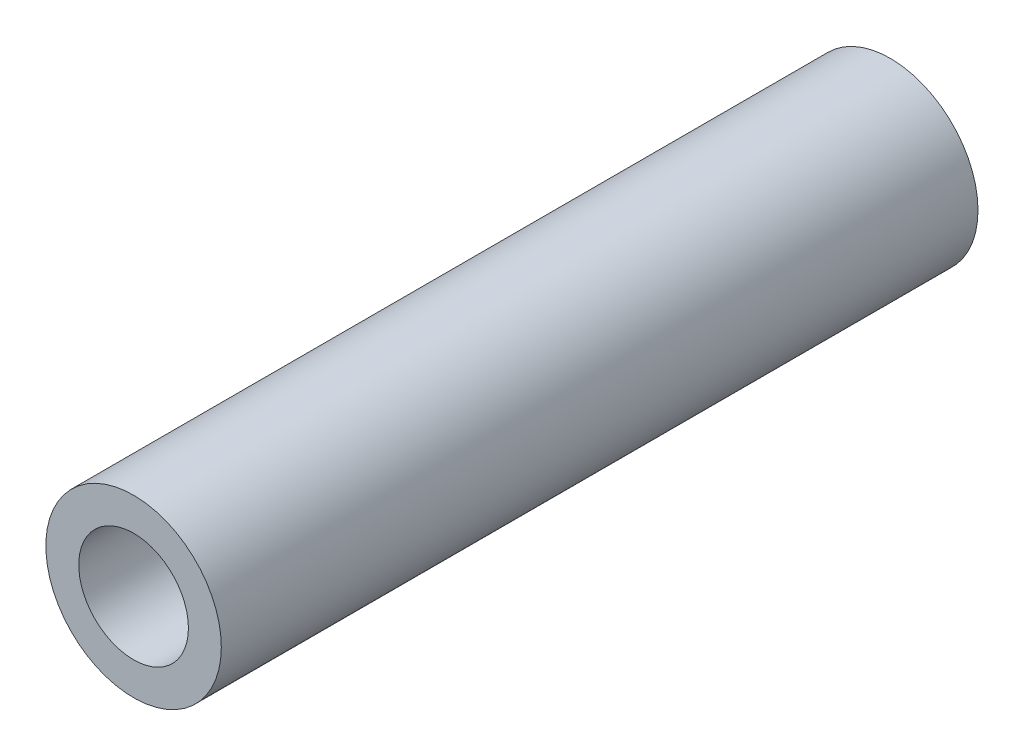
ISO-10303-21;
HEADER;
FILE_DESCRIPTION(('STEP AP214'),'2;1');
FILE_NAME('part.step','',(''),(''),'','','');
FILE_SCHEMA(('AUTOMOTIVE_DESIGN { 1 0 10303 214 1 1 1 1 }'));
ENDSEC;
DATA;
#1=APPLICATION_CONTEXT('core data for automotive mechanical design processes');
#2=APPLICATION_PROTOCOL_DEFINITION('international standard','automotive_design',2000,#1);
#3=PRODUCT_CONTEXT('',#1,'mechanical');
#4=PRODUCT('Part','Part','',(#3));
#5=PRODUCT_RELATED_PRODUCT_CATEGORY('part','',(#4));
#6=PRODUCT_DEFINITION_FORMATION('','',#4);
#7=PRODUCT_DEFINITION_CONTEXT('part definition',#1,'design');
#8=PRODUCT_DEFINITION('design','',#6,#7);
#9=PRODUCT_DEFINITION_SHAPE('','',#8);
#10=(LENGTH_UNIT() NAMED_UNIT(*) SI_UNIT(.MILLI.,.METRE.));
#11=(NAMED_UNIT(*) PLANE_ANGLE_UNIT() SI_UNIT($,.RADIAN.));
#12=(NAMED_UNIT(*) SI_UNIT($,.STERADIAN.) SOLID_ANGLE_UNIT());
#13=UNCERTAINTY_MEASURE_WITH_UNIT(LENGTH_MEASURE(1.E-05),#10,'distance_accuracy_value','');
#14=(GEOMETRIC_REPRESENTATION_CONTEXT(3) GLOBAL_UNCERTAINTY_ASSIGNED_CONTEXT((#13)) GLOBAL_UNIT_ASSIGNED_CONTEXT((#10,
#11,#12)) REPRESENTATION_CONTEXT('',''));
#15=CARTESIAN_POINT('',(0.,0.,0.));
#16=DIRECTION('',(0.,0.,1.));
#17=DIRECTION('',(1.,0.,0.));
#18=AXIS2_PLACEMENT_3D('',#15,#16,#17);
#19=CARTESIAN_POINT('',(0.,0.,69.));
#20=DIRECTION('',(0.,0.,1.));
#21=DIRECTION('',(1.,0.,0.));
#22=AXIS2_PLACEMENT_3D('',#19,#20,#21);
#23=PLANE('',#22);
#24=CARTESIAN_POINT('',(0.,0.,69.));
#25=DIRECTION('',(0.,0.,1.));
#26=DIRECTION('',(1.,0.,0.));
#27=AXIS2_PLACEMENT_3D('',#24,#25,#26);
#28=CIRCLE('',#27,8.);
#29=CARTESIAN_POINT('',(8.,0.,69.));
#30=VERTEX_POINT('',#29);
#31=EDGE_CURVE('E10',#30,#30,#28,.T.);
#32=ORIENTED_EDGE('',*,*,#31,.T.);
#33=EDGE_LOOP('',(#32));
#34=FACE_BOUND('',#33,.T.);
#35=CARTESIAN_POINT('',(0.,0.,69.));
#36=DIRECTION('',(0.,0.,1.));
#37=DIRECTION('',(1.,0.,0.));
#38=AXIS2_PLACEMENT_3D('',#35,#36,#37);
#39=CIRCLE('',#38,5.);
#40=CARTESIAN_POINT('',(5.,0.,69.));
#41=VERTEX_POINT('',#40);
#42=EDGE_CURVE('E41',#41,#41,#39,.T.);
#43=ORIENTED_EDGE('',*,*,#42,.F.);
#44=EDGE_LOOP('',(#43));
#45=FACE_BOUND('',#44,.T.);
#46=ADVANCED_FACE('F30',(#34,#45),#23,.T.);
#47=CARTESIAN_POINT('',(0.,0.,0.));
#48=DIRECTION('',(0.,0.,1.));
#49=DIRECTION('',(1.,0.,0.));
#50=AXIS2_PLACEMENT_3D('',#47,#48,#49);
#51=PLANE('',#50);
#52=CARTESIAN_POINT('',(0.,0.,0.));
#53=DIRECTION('',(0.,0.,1.));
#54=DIRECTION('',(1.,0.,0.));
#55=AXIS2_PLACEMENT_3D('',#52,#53,#54);
#56=CIRCLE('',#55,8.);
#57=CARTESIAN_POINT('',(8.,0.,0.));
#58=VERTEX_POINT('',#57);
#59=EDGE_CURVE('E34',#58,#58,#56,.T.);
#60=ORIENTED_EDGE('',*,*,#59,.F.);
#61=EDGE_LOOP('',(#60));
#62=FACE_BOUND('',#61,.T.);
#63=CARTESIAN_POINT('',(0.,0.,0.));
#64=DIRECTION('',(0.,0.,1.));
#65=DIRECTION('',(1.,0.,0.));
#66=AXIS2_PLACEMENT_3D('',#63,#64,#65);
#67=CIRCLE('',#66,5.);
#68=CARTESIAN_POINT('',(5.,0.,0.));
#69=VERTEX_POINT('',#68);
#70=EDGE_CURVE('E43',#69,#69,#67,.T.);
#71=ORIENTED_EDGE('',*,*,#70,.T.);
#72=EDGE_LOOP('',(#71));
#73=FACE_BOUND('',#72,.T.);
#74=ADVANCED_FACE('F53',(#62,#73),#51,.F.);
#75=CARTESIAN_POINT('',(0.,0.,69.));
#76=DIRECTION('',(0.,0.,-1.));
#77=DIRECTION('',(-1.,0.,0.));
#78=AXIS2_PLACEMENT_3D('',#75,#76,#77);
#79=CYLINDRICAL_SURFACE('',#78,8.);
#80=ORIENTED_EDGE('',*,*,#31,.F.);
#81=EDGE_LOOP('',(#80));
#82=FACE_BOUND('',#81,.T.);
#83=ORIENTED_EDGE('',*,*,#59,.T.);
#84=EDGE_LOOP('',(#83));
#85=FACE_BOUND('',#84,.T.);
#86=ADVANCED_FACE('F32',(#82,#85),#79,.T.);
#87=CARTESIAN_POINT('',(0.,0.,69.));
#88=DIRECTION('',(0.,0.,-1.));
#89=DIRECTION('',(-1.,0.,0.));
#90=AXIS2_PLACEMENT_3D('',#87,#88,#89);
#91=CYLINDRICAL_SURFACE('',#90,5.);
#92=ORIENTED_EDGE('',*,*,#42,.T.);
#93=EDGE_LOOP('',(#92));
#94=FACE_BOUND('',#93,.T.);
#95=ORIENTED_EDGE('',*,*,#70,.F.);
#96=EDGE_LOOP('',(#95));
#97=FACE_BOUND('',#96,.T.);
#98=ADVANCED_FACE('F49',(#94,#97),#91,.F.);
#99=CLOSED_SHELL('',(#46,#74,#86,#98));
#100=MANIFOLD_SOLID_BREP('B2',#99);
#101=ADVANCED_BREP_SHAPE_REPRESENTATION('',(#18,#100),#14);
#102=SHAPE_DEFINITION_REPRESENTATION(#9,#101);
ENDSEC;
END-ISO-10303-21;
